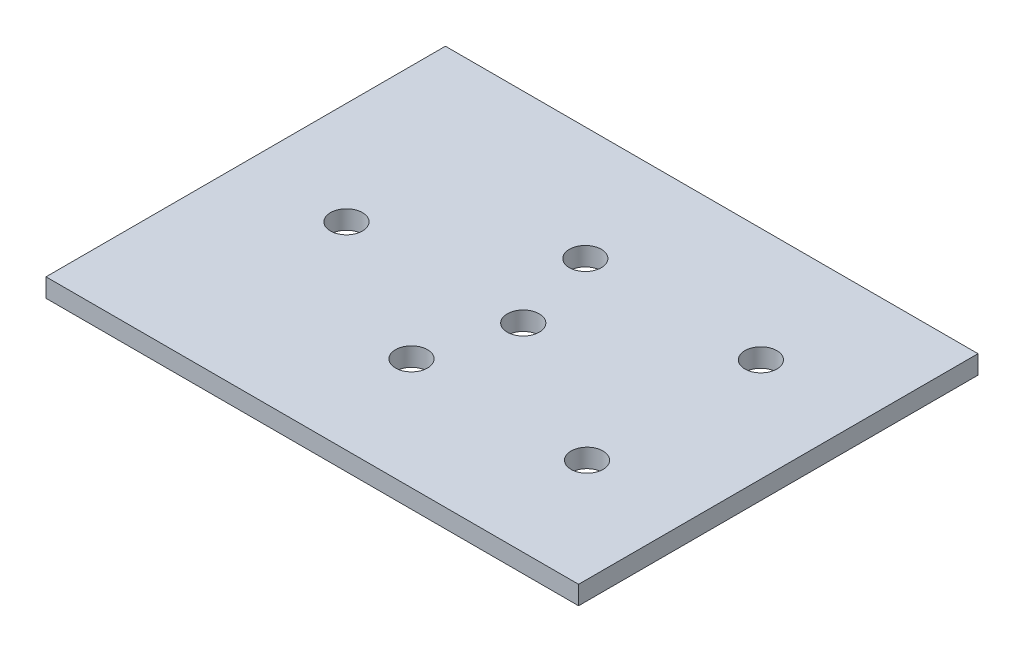
ISO-10303-21;
HEADER;
FILE_DESCRIPTION(('STEP AP214'),'2;1');
FILE_NAME('part.step','',(''),(''),'','','');
FILE_SCHEMA(('AUTOMOTIVE_DESIGN { 1 0 10303 214 1 1 1 1 }'));
ENDSEC;
DATA;
#1=APPLICATION_CONTEXT('core data for automotive mechanical design processes');
#2=APPLICATION_PROTOCOL_DEFINITION('international standard','automotive_design',2000,#1);
#3=PRODUCT_CONTEXT('',#1,'mechanical');
#4=PRODUCT('Part','Part','',(#3));
#5=PRODUCT_RELATED_PRODUCT_CATEGORY('part','',(#4));
#6=PRODUCT_DEFINITION_FORMATION('','',#4);
#7=PRODUCT_DEFINITION_CONTEXT('part definition',#1,'design');
#8=PRODUCT_DEFINITION('design','',#6,#7);
#9=PRODUCT_DEFINITION_SHAPE('','',#8);
#10=(LENGTH_UNIT() NAMED_UNIT(*) SI_UNIT(.MILLI.,.METRE.));
#11=(NAMED_UNIT(*) PLANE_ANGLE_UNIT() SI_UNIT($,.RADIAN.));
#12=(NAMED_UNIT(*) SI_UNIT($,.STERADIAN.) SOLID_ANGLE_UNIT());
#13=UNCERTAINTY_MEASURE_WITH_UNIT(LENGTH_MEASURE(1.E-05),#10,'distance_accuracy_value','');
#14=(GEOMETRIC_REPRESENTATION_CONTEXT(3) GLOBAL_UNCERTAINTY_ASSIGNED_CONTEXT((#13)) GLOBAL_UNIT_ASSIGNED_CONTEXT((#10,
#11,#12)) REPRESENTATION_CONTEXT('',''));
#15=CARTESIAN_POINT('',(0.,0.,0.));
#16=DIRECTION('',(0.,0.,1.));
#17=DIRECTION('',(1.,0.,0.));
#18=AXIS2_PLACEMENT_3D('',#15,#16,#17);
#19=CARTESIAN_POINT('',(-63.44896432945,3.5,-23.2484478584791));
#20=DIRECTION('',(1.,0.,0.));
#21=DIRECTION('',(0.,0.,-1.));
#22=AXIS2_PLACEMENT_3D('',#19,#20,#21);
#23=PLANE('',#22);
#24=DIRECTION('',(0.,0.,1.));
#25=VECTOR('',#24,1.);
#26=CARTESIAN_POINT('',(-63.44896432945,0.,-23.2484478584791));
#27=LINE('',#26,#25);
#28=CARTESIAN_POINT('',(-63.44896432945,0.,-23.2484478584791));
#29=VERTEX_POINT('',#28);
#30=CARTESIAN_POINT('',(-63.44896432945,0.,51.7515521415209));
#31=VERTEX_POINT('',#30);
#32=EDGE_CURVE('E105',#29,#31,#27,.T.);
#33=ORIENTED_EDGE('',*,*,#32,.T.);
#34=DIRECTION('',(0.,-1.,0.));
#35=VECTOR('',#34,1.);
#36=CARTESIAN_POINT('',(-63.44896432945,3.5,51.7515521415209));
#37=LINE('',#36,#35);
#38=CARTESIAN_POINT('',(-63.44896432945,3.5,51.7515521415209));
#39=VERTEX_POINT('',#38);
#40=EDGE_CURVE('E11',#39,#31,#37,.T.);
#41=ORIENTED_EDGE('',*,*,#40,.F.);
#42=DIRECTION('',(0.,0.,1.));
#43=VECTOR('',#42,1.);
#44=CARTESIAN_POINT('',(-63.44896432945,3.5,-23.2484478584791));
#45=LINE('',#44,#43);
#46=CARTESIAN_POINT('',(-63.44896432945,3.5,-23.2484478584791));
#47=VERTEX_POINT('',#46);
#48=EDGE_CURVE('E93',#47,#39,#45,.T.);
#49=ORIENTED_EDGE('',*,*,#48,.F.);
#50=DIRECTION('',(0.,-1.,0.));
#51=VECTOR('',#50,1.);
#52=CARTESIAN_POINT('',(-63.44896432945,3.5,-23.2484478584791));
#53=LINE('',#52,#51);
#54=EDGE_CURVE('E101',#47,#29,#53,.T.);
#55=ORIENTED_EDGE('',*,*,#54,.T.);
#56=EDGE_LOOP('',(#33,#41,#49,#55));
#57=FACE_BOUND('',#56,.T.);
#58=ADVANCED_FACE('F42',(#57),#23,.F.);
#59=CARTESIAN_POINT('',(-63.44896432945,3.5,51.7515521415209));
#60=DIRECTION('',(0.,0.,-1.));
#61=DIRECTION('',(-1.,0.,0.));
#62=AXIS2_PLACEMENT_3D('',#59,#60,#61);
#63=PLANE('',#62);
#64=DIRECTION('',(1.,0.,0.));
#65=VECTOR('',#64,1.);
#66=CARTESIAN_POINT('',(-63.44896432945,0.,51.7515521415209));
#67=LINE('',#66,#65);
#68=CARTESIAN_POINT('',(36.55103567055,0.,51.7515521415209));
#69=VERTEX_POINT('',#68);
#70=EDGE_CURVE('E97',#31,#69,#67,.T.);
#71=ORIENTED_EDGE('',*,*,#70,.T.);
#72=DIRECTION('',(0.,-1.,0.));
#73=VECTOR('',#72,1.);
#74=CARTESIAN_POINT('',(36.55103567055,3.5,51.7515521415209));
#75=LINE('',#74,#73);
#76=CARTESIAN_POINT('',(36.55103567055,3.5,51.7515521415209));
#77=VERTEX_POINT('',#76);
#78=EDGE_CURVE('E50',#77,#69,#75,.T.);
#79=ORIENTED_EDGE('',*,*,#78,.F.);
#80=DIRECTION('',(1.,0.,0.));
#81=VECTOR('',#80,1.);
#82=CARTESIAN_POINT('',(-63.44896432945,3.5,51.7515521415209));
#83=LINE('',#82,#81);
#84=EDGE_CURVE('E88',#39,#77,#83,.T.);
#85=ORIENTED_EDGE('',*,*,#84,.F.);
#86=ORIENTED_EDGE('',*,*,#40,.T.);
#87=EDGE_LOOP('',(#71,#79,#85,#86));
#88=FACE_BOUND('',#87,.T.);
#89=ADVANCED_FACE('F96',(#88),#63,.F.);
#90=CARTESIAN_POINT('',(36.55103567055,3.5,-23.2484478584791));
#91=DIRECTION('',(-1.,0.,0.));
#92=DIRECTION('',(0.,0.,1.));
#93=AXIS2_PLACEMENT_3D('',#90,#91,#92);
#94=PLANE('',#93);
#95=DIRECTION('',(0.,0.,-1.));
#96=VECTOR('',#95,1.);
#97=CARTESIAN_POINT('',(36.55103567055,0.,-23.2484478584791));
#98=LINE('',#97,#96);
#99=CARTESIAN_POINT('',(36.55103567055,0.,-23.2484478584791));
#100=VERTEX_POINT('',#99);
#101=EDGE_CURVE('E75',#69,#100,#98,.T.);
#102=ORIENTED_EDGE('',*,*,#101,.T.);
#103=DIRECTION('',(0.,-1.,0.));
#104=VECTOR('',#103,1.);
#105=CARTESIAN_POINT('',(36.55103567055,3.5,-23.2484478584791));
#106=LINE('',#105,#104);
#107=CARTESIAN_POINT('',(36.55103567055,3.5,-23.2484478584791));
#108=VERTEX_POINT('',#107);
#109=EDGE_CURVE('E98',#108,#100,#106,.T.);
#110=ORIENTED_EDGE('',*,*,#109,.F.);
#111=DIRECTION('',(0.,0.,-1.));
#112=VECTOR('',#111,1.);
#113=CARTESIAN_POINT('',(36.55103567055,3.5,-23.2484478584791));
#114=LINE('',#113,#112);
#115=EDGE_CURVE('E91',#77,#108,#114,.T.);
#116=ORIENTED_EDGE('',*,*,#115,.F.);
#117=ORIENTED_EDGE('',*,*,#78,.T.);
#118=EDGE_LOOP('',(#102,#110,#116,#117));
#119=FACE_BOUND('',#118,.T.);
#120=ADVANCED_FACE('F99',(#119),#94,.F.);
#121=CARTESIAN_POINT('',(-63.44896432945,3.5,-23.2484478584791));
#122=DIRECTION('',(0.,0.,1.));
#123=DIRECTION('',(1.,0.,0.));
#124=AXIS2_PLACEMENT_3D('',#121,#122,#123);
#125=PLANE('',#124);
#126=DIRECTION('',(-1.,0.,0.));
#127=VECTOR('',#126,1.);
#128=CARTESIAN_POINT('',(-63.44896432945,0.,-23.2484478584791));
#129=LINE('',#128,#127);
#130=EDGE_CURVE('E81',#100,#29,#129,.T.);
#131=ORIENTED_EDGE('',*,*,#130,.T.);
#132=ORIENTED_EDGE('',*,*,#54,.F.);
#133=DIRECTION('',(-1.,0.,0.));
#134=VECTOR('',#133,1.);
#135=CARTESIAN_POINT('',(-63.44896432945,3.5,-23.2484478584791));
#136=LINE('',#135,#134);
#137=EDGE_CURVE('E58',#108,#47,#136,.T.);
#138=ORIENTED_EDGE('',*,*,#137,.F.);
#139=ORIENTED_EDGE('',*,*,#109,.T.);
#140=EDGE_LOOP('',(#131,#132,#138,#139));
#141=FACE_BOUND('',#140,.T.);
#142=ADVANCED_FACE('F113',(#141),#125,.F.);
#143=CARTESIAN_POINT('',(0.,3.5,0.));
#144=DIRECTION('',(0.,1.,0.));
#145=DIRECTION('',(0.,0.,1.));
#146=AXIS2_PLACEMENT_3D('',#143,#144,#145);
#147=PLANE('',#146);
#148=CARTESIAN_POINT('',(-11.1286886374627,3.5,14.4579705016577));
#149=DIRECTION('',(0.,-1.,0.));
#150=DIRECTION('',(0.,0.,-1.));
#151=AXIS2_PLACEMENT_3D('',#148,#149,#150);
#152=CIRCLE('',#151,2.99999999999997);
#153=CARTESIAN_POINT('',(-11.1286886374627,3.5,11.4579705016578));
#154=VERTEX_POINT('',#153);
#155=EDGE_CURVE('E148',#154,#154,#152,.T.);
#156=ORIENTED_EDGE('',*,*,#155,.T.);
#157=EDGE_LOOP('',(#156));
#158=FACE_BOUND('',#157,.T.);
#159=CARTESIAN_POINT('',(-44.1818149262901,3.5,14.5976984919184));
#160=DIRECTION('',(0.,-1.,0.));
#161=DIRECTION('',(0.,0.,-1.));
#162=AXIS2_PLACEMENT_3D('',#159,#160,#161);
#163=CIRCLE('',#162,2.99999999999997);
#164=CARTESIAN_POINT('',(-44.1818149262901,3.5,11.5976984919184));
#165=VERTEX_POINT('',#164);
#166=EDGE_CURVE('E142',#165,#165,#163,.T.);
#167=ORIENTED_EDGE('',*,*,#166,.T.);
#168=EDGE_LOOP('',(#167));
#169=FACE_BOUND('',#168,.T.);
#170=CARTESIAN_POINT('',(-15.7916917898016,3.5,30.7793162149009));
#171=DIRECTION('',(0.,1.,0.));
#172=DIRECTION('',(0.,0.,1.));
#173=AXIS2_PLACEMENT_3D('',#170,#171,#172);
#174=CIRCLE('',#173,2.99999999999999);
#175=CARTESIAN_POINT('',(-15.7916917898016,3.5,33.7793162149009));
#176=VERTEX_POINT('',#175);
#177=EDGE_CURVE('E136',#176,#176,#174,.T.);
#178=ORIENTED_EDGE('',*,*,#177,.F.);
#179=EDGE_LOOP('',(#178));
#180=FACE_BOUND('',#179,.T.);
#181=CARTESIAN_POINT('',(17.1704322982785,3.5,30.7793162149008));
#182=DIRECTION('',(0.,1.,0.));
#183=DIRECTION('',(0.,0.,1.));
#184=AXIS2_PLACEMENT_3D('',#181,#182,#183);
#185=CIRCLE('',#184,2.99999999999999);
#186=CARTESIAN_POINT('',(17.1704322982785,3.5,33.7793162149008));
#187=VERTEX_POINT('',#186);
#188=EDGE_CURVE('E130',#187,#187,#185,.T.);
#189=ORIENTED_EDGE('',*,*,#188,.F.);
#190=EDGE_LOOP('',(#189));
#191=FACE_BOUND('',#190,.T.);
#192=CARTESIAN_POINT('',(-15.7916917898017,3.5,-1.86587472617306));
#193=DIRECTION('',(0.,1.,0.));
#194=DIRECTION('',(0.,0.,1.));
#195=AXIS2_PLACEMENT_3D('',#192,#193,#194);
#196=CIRCLE('',#195,2.99999999999999);
#197=CARTESIAN_POINT('',(-15.7916917898017,3.5,1.13412527382693));
#198=VERTEX_POINT('',#197);
#199=EDGE_CURVE('E124',#198,#198,#196,.T.);
#200=ORIENTED_EDGE('',*,*,#199,.F.);
#201=EDGE_LOOP('',(#200));
#202=FACE_BOUND('',#201,.T.);
#203=CARTESIAN_POINT('',(17.1704322982783,3.5,-1.86587472617317));
#204=DIRECTION('',(0.,1.,0.));
#205=DIRECTION('',(0.,0.,1.));
#206=AXIS2_PLACEMENT_3D('',#203,#204,#205);
#207=CIRCLE('',#206,2.99999999999999);
#208=CARTESIAN_POINT('',(17.1704322982783,3.5,1.13412527382682));
#209=VERTEX_POINT('',#208);
#210=EDGE_CURVE('E108',#209,#209,#207,.T.);
#211=ORIENTED_EDGE('',*,*,#210,.F.);
#212=EDGE_LOOP('',(#211));
#213=FACE_BOUND('',#212,.T.);
#214=ORIENTED_EDGE('',*,*,#48,.T.);
#215=ORIENTED_EDGE('',*,*,#84,.T.);
#216=ORIENTED_EDGE('',*,*,#115,.T.);
#217=ORIENTED_EDGE('',*,*,#137,.T.);
#218=EDGE_LOOP('',(#214,#215,#216,#217));
#219=FACE_BOUND('',#218,.T.);
#220=ADVANCED_FACE('F89',(#158,#169,#180,#191,#202,#213,#219),#147,.T.);
#221=CARTESIAN_POINT('',(0.,0.,0.));
#222=DIRECTION('',(0.,1.,0.));
#223=DIRECTION('',(0.,0.,1.));
#224=AXIS2_PLACEMENT_3D('',#221,#222,#223);
#225=PLANE('',#224);
#226=CARTESIAN_POINT('',(-11.1286886374627,0.,14.4579705016577));
#227=DIRECTION('',(0.,-1.,0.));
#228=DIRECTION('',(0.,0.,-1.));
#229=AXIS2_PLACEMENT_3D('',#226,#227,#228);
#230=CIRCLE('',#229,2.99999999999999);
#231=CARTESIAN_POINT('',(-11.1286886374627,0.,11.4579705016578));
#232=VERTEX_POINT('',#231);
#233=EDGE_CURVE('E151',#232,#232,#230,.T.);
#234=ORIENTED_EDGE('',*,*,#233,.F.);
#235=EDGE_LOOP('',(#234));
#236=FACE_BOUND('',#235,.T.);
#237=CARTESIAN_POINT('',(-44.1818149262901,0.,14.5976984919184));
#238=DIRECTION('',(0.,-1.,0.));
#239=DIRECTION('',(0.,0.,-1.));
#240=AXIS2_PLACEMENT_3D('',#237,#238,#239);
#241=CIRCLE('',#240,3.);
#242=CARTESIAN_POINT('',(-44.1818149262901,0.,11.5976984919184));
#243=VERTEX_POINT('',#242);
#244=EDGE_CURVE('E145',#243,#243,#241,.T.);
#245=ORIENTED_EDGE('',*,*,#244,.F.);
#246=EDGE_LOOP('',(#245));
#247=FACE_BOUND('',#246,.T.);
#248=CARTESIAN_POINT('',(-15.7916917898016,0.,30.7793162149009));
#249=DIRECTION('',(0.,-1.,0.));
#250=DIRECTION('',(0.,0.,-1.));
#251=AXIS2_PLACEMENT_3D('',#248,#249,#250);
#252=CIRCLE('',#251,2.99999999999999);
#253=CARTESIAN_POINT('',(-15.7916917898016,0.,27.7793162149009));
#254=VERTEX_POINT('',#253);
#255=EDGE_CURVE('E139',#254,#254,#252,.T.);
#256=ORIENTED_EDGE('',*,*,#255,.F.);
#257=EDGE_LOOP('',(#256));
#258=FACE_BOUND('',#257,.T.);
#259=CARTESIAN_POINT('',(17.1704322982785,0.,30.7793162149008));
#260=DIRECTION('',(0.,-1.,0.));
#261=DIRECTION('',(0.,0.,-1.));
#262=AXIS2_PLACEMENT_3D('',#259,#260,#261);
#263=CIRCLE('',#262,2.99999999999999);
#264=CARTESIAN_POINT('',(17.1704322982785,0.,27.7793162149008));
#265=VERTEX_POINT('',#264);
#266=EDGE_CURVE('E133',#265,#265,#263,.T.);
#267=ORIENTED_EDGE('',*,*,#266,.F.);
#268=EDGE_LOOP('',(#267));
#269=FACE_BOUND('',#268,.T.);
#270=CARTESIAN_POINT('',(-15.7916917898017,0.,-1.86587472617306));
#271=DIRECTION('',(0.,-1.,0.));
#272=DIRECTION('',(0.,0.,-1.));
#273=AXIS2_PLACEMENT_3D('',#270,#271,#272);
#274=CIRCLE('',#273,2.99999999999999);
#275=CARTESIAN_POINT('',(-15.7916917898017,0.,-4.86587472617305));
#276=VERTEX_POINT('',#275);
#277=EDGE_CURVE('E127',#276,#276,#274,.T.);
#278=ORIENTED_EDGE('',*,*,#277,.F.);
#279=EDGE_LOOP('',(#278));
#280=FACE_BOUND('',#279,.T.);
#281=CARTESIAN_POINT('',(17.1704322982783,-1.55581880399552E-11,-1.86587472617317));
#282=DIRECTION('',(0.,-1.,0.));
#283=DIRECTION('',(0.,0.,-1.));
#284=AXIS2_PLACEMENT_3D('',#281,#282,#283);
#285=CIRCLE('',#284,2.99999999999999);
#286=CARTESIAN_POINT('',(17.1704322982783,-1.55581880399552E-11,-4.86587472617316));
#287=VERTEX_POINT('',#286);
#288=EDGE_CURVE('E121',#287,#287,#285,.T.);
#289=ORIENTED_EDGE('',*,*,#288,.F.);
#290=EDGE_LOOP('',(#289));
#291=FACE_BOUND('',#290,.T.);
#292=ORIENTED_EDGE('',*,*,#32,.F.);
#293=ORIENTED_EDGE('',*,*,#130,.F.);
#294=ORIENTED_EDGE('',*,*,#101,.F.);
#295=ORIENTED_EDGE('',*,*,#70,.F.);
#296=EDGE_LOOP('',(#292,#293,#294,#295));
#297=FACE_BOUND('',#296,.T.);
#298=ADVANCED_FACE('F116',(#236,#247,#258,#269,#280,#291,#297),#225,.F.);
#299=CARTESIAN_POINT('',(17.1704322982783,-1.555700013256E-11,-1.86587472617317));
#300=DIRECTION('',(0.,-1.,0.));
#301=DIRECTION('',(0.,0.,-1.));
#302=AXIS2_PLACEMENT_3D('',#299,#300,#301);
#303=CYLINDRICAL_SURFACE('',#302,2.99999999999999);
#304=ORIENTED_EDGE('',*,*,#210,.T.);
#305=EDGE_LOOP('',(#304));
#306=FACE_BOUND('',#305,.T.);
#307=ORIENTED_EDGE('',*,*,#288,.T.);
#308=EDGE_LOOP('',(#307));
#309=FACE_BOUND('',#308,.T.);
#310=ADVANCED_FACE('F159',(#306,#309),#303,.F.);
#311=CARTESIAN_POINT('',(-15.7916917898017,0.,-1.86587472617306));
#312=DIRECTION('',(0.,-1.,0.));
#313=DIRECTION('',(0.,0.,-1.));
#314=AXIS2_PLACEMENT_3D('',#311,#312,#313);
#315=CYLINDRICAL_SURFACE('',#314,2.99999999999999);
#316=ORIENTED_EDGE('',*,*,#199,.T.);
#317=EDGE_LOOP('',(#316));
#318=FACE_BOUND('',#317,.T.);
#319=ORIENTED_EDGE('',*,*,#277,.T.);
#320=EDGE_LOOP('',(#319));
#321=FACE_BOUND('',#320,.T.);
#322=ADVANCED_FACE('F172',(#318,#321),#315,.F.);
#323=CARTESIAN_POINT('',(17.1704322982785,0.,30.7793162149008));
#324=DIRECTION('',(0.,-1.,0.));
#325=DIRECTION('',(0.,0.,-1.));
#326=AXIS2_PLACEMENT_3D('',#323,#324,#325);
#327=CYLINDRICAL_SURFACE('',#326,2.99999999999999);
#328=ORIENTED_EDGE('',*,*,#188,.T.);
#329=EDGE_LOOP('',(#328));
#330=FACE_BOUND('',#329,.T.);
#331=ORIENTED_EDGE('',*,*,#266,.T.);
#332=EDGE_LOOP('',(#331));
#333=FACE_BOUND('',#332,.T.);
#334=ADVANCED_FACE('F179',(#330,#333),#327,.F.);
#335=CARTESIAN_POINT('',(-15.7916917898016,0.,30.7793162149009));
#336=DIRECTION('',(0.,-1.,0.));
#337=DIRECTION('',(0.,0.,-1.));
#338=AXIS2_PLACEMENT_3D('',#335,#336,#337);
#339=CYLINDRICAL_SURFACE('',#338,2.99999999999999);
#340=ORIENTED_EDGE('',*,*,#177,.T.);
#341=EDGE_LOOP('',(#340));
#342=FACE_BOUND('',#341,.T.);
#343=ORIENTED_EDGE('',*,*,#255,.T.);
#344=EDGE_LOOP('',(#343));
#345=FACE_BOUND('',#344,.T.);
#346=ADVANCED_FACE('F213',(#342,#345),#339,.F.);
#347=CARTESIAN_POINT('',(-44.1818149262901,0.,14.5976984919184));
#348=DIRECTION('',(0.,-1.,0.));
#349=DIRECTION('',(0.,0.,-1.));
#350=AXIS2_PLACEMENT_3D('',#347,#348,#349);
#351=CYLINDRICAL_SURFACE('',#350,2.99999999999998);
#352=ORIENTED_EDGE('',*,*,#166,.F.);
#353=EDGE_LOOP('',(#352));
#354=FACE_BOUND('',#353,.T.);
#355=ORIENTED_EDGE('',*,*,#244,.T.);
#356=EDGE_LOOP('',(#355));
#357=FACE_BOUND('',#356,.T.);
#358=ADVANCED_FACE('F218',(#354,#357),#351,.F.);
#359=CARTESIAN_POINT('',(-11.1286886374627,0.,14.4579705016577));
#360=DIRECTION('',(0.,-1.,0.));
#361=DIRECTION('',(0.,0.,-1.));
#362=AXIS2_PLACEMENT_3D('',#359,#360,#361);
#363=CYLINDRICAL_SURFACE('',#362,2.99999999999998);
#364=ORIENTED_EDGE('',*,*,#155,.F.);
#365=EDGE_LOOP('',(#364));
#366=FACE_BOUND('',#365,.T.);
#367=ORIENTED_EDGE('',*,*,#233,.T.);
#368=EDGE_LOOP('',(#367));
#369=FACE_BOUND('',#368,.T.);
#370=ADVANCED_FACE('F155',(#366,#369),#363,.F.);
#371=CLOSED_SHELL('',(#58,#89,#120,#142,#220,#298,#310,#322,#334,#346,#358,#370));
#372=MANIFOLD_SOLID_BREP('B2',#371);
#373=ADVANCED_BREP_SHAPE_REPRESENTATION('',(#18,#372),#14);
#374=SHAPE_DEFINITION_REPRESENTATION(#9,#373);
ENDSEC;
END-ISO-10303-21;
